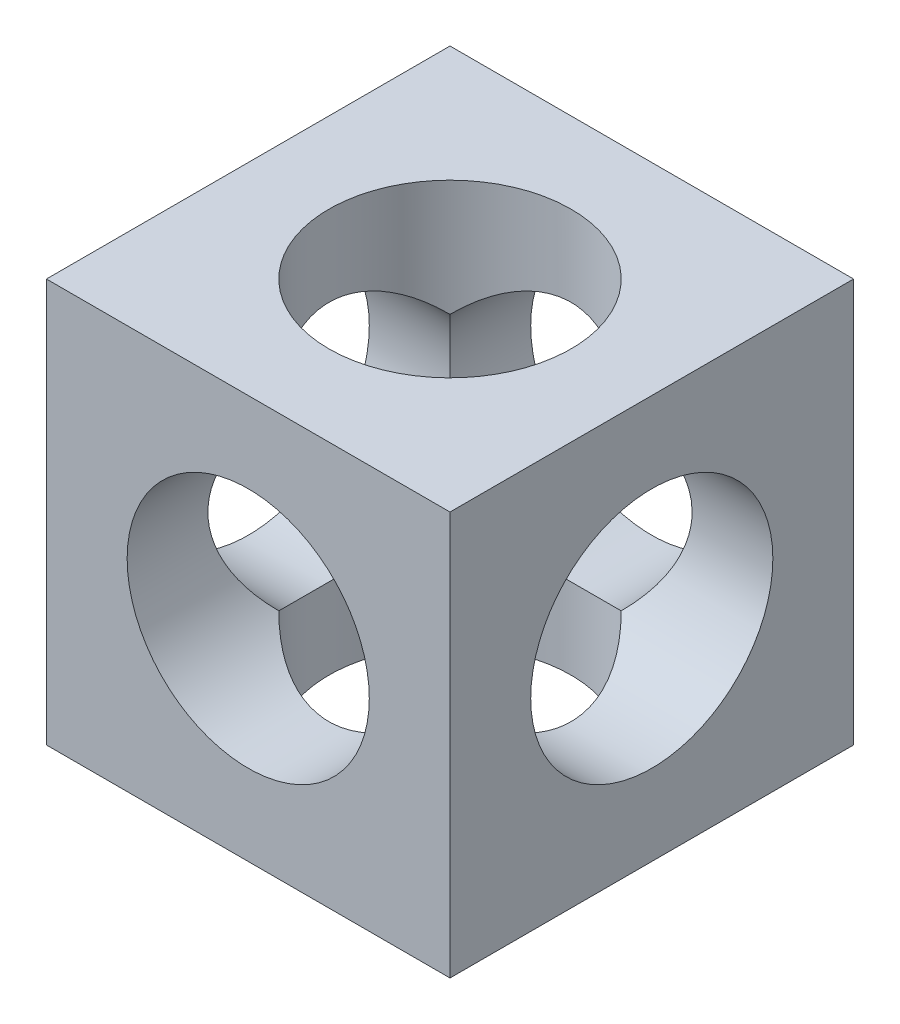
ISO-10303-21;
HEADER;
FILE_DESCRIPTION(('STEP AP214'),'2;1');
FILE_NAME('part.step','',(''),(''),'','','');
FILE_SCHEMA(('AUTOMOTIVE_DESIGN { 1 0 10303 214 1 1 1 1 }'));
ENDSEC;
DATA;
#1=APPLICATION_CONTEXT('core data for automotive mechanical design processes');
#2=APPLICATION_PROTOCOL_DEFINITION('international standard','automotive_design',2000,#1);
#3=PRODUCT_CONTEXT('',#1,'mechanical');
#4=PRODUCT('Part','Part','',(#3));
#5=PRODUCT_RELATED_PRODUCT_CATEGORY('part','',(#4));
#6=PRODUCT_DEFINITION_FORMATION('','',#4);
#7=PRODUCT_DEFINITION_CONTEXT('part definition',#1,'design');
#8=PRODUCT_DEFINITION('design','',#6,#7);
#9=PRODUCT_DEFINITION_SHAPE('','',#8);
#10=(LENGTH_UNIT() NAMED_UNIT(*) SI_UNIT(.MILLI.,.METRE.));
#11=(NAMED_UNIT(*) PLANE_ANGLE_UNIT() SI_UNIT($,.RADIAN.));
#12=(NAMED_UNIT(*) SI_UNIT($,.STERADIAN.) SOLID_ANGLE_UNIT());
#13=UNCERTAINTY_MEASURE_WITH_UNIT(LENGTH_MEASURE(1.E-05),#10,'distance_accuracy_value','');
#14=(GEOMETRIC_REPRESENTATION_CONTEXT(3) GLOBAL_UNCERTAINTY_ASSIGNED_CONTEXT((#13)) GLOBAL_UNIT_ASSIGNED_CONTEXT((#10,
#11,#12)) REPRESENTATION_CONTEXT('',''));
#15=CARTESIAN_POINT('',(0.,0.,0.));
#16=DIRECTION('',(0.,0.,1.));
#17=DIRECTION('',(1.,0.,0.));
#18=AXIS2_PLACEMENT_3D('',#15,#16,#17);
#19=CARTESIAN_POINT('',(2.5,5.,-2.5));
#20=DIRECTION('',(0.,-1.,0.));
#21=DIRECTION('',(0.,0.,-1.));
#22=AXIS2_PLACEMENT_3D('',#19,#20,#21);
#23=CYLINDRICAL_SURFACE('',#22,1.5);
#24=CARTESIAN_POINT('',(2.5,2.5,-2.5));
#25=DIRECTION('',(0.707106781186547,-0.707106781186547,0.));
#26=DIRECTION('',(-0.707106781186547,-0.707106781186547,0.));
#27=AXIS2_PLACEMENT_3D('',#24,#25,#26);
#28=ELLIPSE('',#27,2.12132034355964,1.5);
#29=CARTESIAN_POINT('',(3.56066017177982,3.56066017177982,-1.43933982822018));
#30=VERTEX_POINT('',#29);
#31=CARTESIAN_POINT('',(3.56066017177982,3.56066017177982,-3.56066017177982));
#32=VERTEX_POINT('',#31);
#33=EDGE_CURVE('E109',#30,#32,#28,.F.);
#34=ORIENTED_EDGE('',*,*,#33,.F.);
#35=CARTESIAN_POINT('',(2.5,2.5,-2.5));
#36=DIRECTION('',(0.,-0.707106781186547,0.707106781186547));
#37=DIRECTION('',(0.,-0.707106781186547,-0.707106781186547));
#38=AXIS2_PLACEMENT_3D('',#35,#36,#37);
#39=ELLIPSE('',#38,2.12132034355964,1.5);
#40=CARTESIAN_POINT('',(1.43933982822018,3.56066017177982,-1.43933982822018));
#41=VERTEX_POINT('',#40);
#42=EDGE_CURVE('E116',#41,#30,#39,.F.);
#43=ORIENTED_EDGE('',*,*,#42,.F.);
#44=CARTESIAN_POINT('',(2.5,2.5,-2.5));
#45=DIRECTION('',(-0.707106781186547,-0.707106781186547,0.));
#46=DIRECTION('',(0.707106781186547,-0.707106781186547,0.));
#47=AXIS2_PLACEMENT_3D('',#44,#45,#46);
#48=ELLIPSE('',#47,2.12132034355964,1.5);
#49=CARTESIAN_POINT('',(1.43933982822018,3.56066017177982,-3.56066017177982));
#50=VERTEX_POINT('',#49);
#51=EDGE_CURVE('E69',#50,#41,#48,.F.);
#52=ORIENTED_EDGE('',*,*,#51,.F.);
#53=CARTESIAN_POINT('',(2.5,2.5,-2.5));
#54=DIRECTION('',(0.,-0.707106781186547,-0.707106781186547));
#55=DIRECTION('',(0.,-0.707106781186547,0.707106781186547));
#56=AXIS2_PLACEMENT_3D('',#53,#54,#55);
#57=ELLIPSE('',#56,2.12132034355964,1.5);
#58=EDGE_CURVE('E122',#32,#50,#57,.F.);
#59=ORIENTED_EDGE('',*,*,#58,.F.);
#60=EDGE_LOOP('',(#34,#43,#52,#59));
#61=FACE_BOUND('',#60,.T.);
#62=CARTESIAN_POINT('',(2.5,5.,-2.5));
#63=DIRECTION('',(0.,1.,0.));
#64=DIRECTION('',(0.,0.,1.));
#65=AXIS2_PLACEMENT_3D('',#62,#63,#64);
#66=CIRCLE('',#65,1.5);
#67=CARTESIAN_POINT('',(2.5,5.,-1.));
#68=VERTEX_POINT('',#67);
#69=EDGE_CURVE('E171',#68,#68,#66,.T.);
#70=ORIENTED_EDGE('',*,*,#69,.T.);
#71=EDGE_LOOP('',(#70));
#72=FACE_BOUND('',#71,.T.);
#73=ADVANCED_FACE('F45',(#61,#72),#23,.F.);
#74=CARTESIAN_POINT('',(0.,5.,0.));
#75=DIRECTION('',(0.,-1.,0.));
#76=DIRECTION('',(0.,0.,-1.));
#77=AXIS2_PLACEMENT_3D('',#74,#75,#76);
#78=PLANE('',#77);
#79=DIRECTION('',(0.,0.,1.));
#80=VECTOR('',#79,1.);
#81=CARTESIAN_POINT('',(0.,5.,0.));
#82=LINE('',#81,#80);
#83=CARTESIAN_POINT('',(0.,5.,-5.));
#84=VERTEX_POINT('',#83);
#85=CARTESIAN_POINT('',(0.,5.,0.));
#86=VERTEX_POINT('',#85);
#87=EDGE_CURVE('E160',#84,#86,#82,.T.);
#88=ORIENTED_EDGE('',*,*,#87,.T.);
#89=DIRECTION('',(1.,0.,0.));
#90=VECTOR('',#89,1.);
#91=CARTESIAN_POINT('',(0.,5.,0.));
#92=LINE('',#91,#90);
#93=CARTESIAN_POINT('',(5.,5.,0.));
#94=VERTEX_POINT('',#93);
#95=EDGE_CURVE('E177',#86,#94,#92,.T.);
#96=ORIENTED_EDGE('',*,*,#95,.T.);
#97=DIRECTION('',(0.,0.,-1.));
#98=VECTOR('',#97,1.);
#99=CARTESIAN_POINT('',(5.,5.,0.));
#100=LINE('',#99,#98);
#101=CARTESIAN_POINT('',(5.,5.,-5.));
#102=VERTEX_POINT('',#101);
#103=EDGE_CURVE('E174',#94,#102,#100,.T.);
#104=ORIENTED_EDGE('',*,*,#103,.T.);
#105=DIRECTION('',(-1.,0.,0.));
#106=VECTOR('',#105,1.);
#107=CARTESIAN_POINT('',(0.,5.,-5.));
#108=LINE('',#107,#106);
#109=EDGE_CURVE('E156',#102,#84,#108,.T.);
#110=ORIENTED_EDGE('',*,*,#109,.T.);
#111=EDGE_LOOP('',(#88,#96,#104,#110));
#112=FACE_BOUND('',#111,.T.);
#113=ORIENTED_EDGE('',*,*,#69,.F.);
#114=EDGE_LOOP('',(#113));
#115=FACE_BOUND('',#114,.T.);
#116=ADVANCED_FACE('F231',(#112,#115),#78,.F.);
#117=CARTESIAN_POINT('',(0.,0.,0.));
#118=DIRECTION('',(0.,-1.,0.));
#119=DIRECTION('',(0.,0.,-1.));
#120=AXIS2_PLACEMENT_3D('',#117,#118,#119);
#121=PLANE('',#120);
#122=DIRECTION('',(0.,0.,1.));
#123=VECTOR('',#122,1.);
#124=CARTESIAN_POINT('',(0.,0.,0.));
#125=LINE('',#124,#123);
#126=CARTESIAN_POINT('',(0.,0.,-5.));
#127=VERTEX_POINT('',#126);
#128=CARTESIAN_POINT('',(0.,0.,0.));
#129=VERTEX_POINT('',#128);
#130=EDGE_CURVE('E167',#127,#129,#125,.T.);
#131=ORIENTED_EDGE('',*,*,#130,.F.);
#132=DIRECTION('',(-1.,0.,0.));
#133=VECTOR('',#132,1.);
#134=CARTESIAN_POINT('',(0.,0.,-5.));
#135=LINE('',#134,#133);
#136=CARTESIAN_POINT('',(5.,0.,-5.));
#137=VERTEX_POINT('',#136);
#138=EDGE_CURVE('E157',#137,#127,#135,.T.);
#139=ORIENTED_EDGE('',*,*,#138,.F.);
#140=DIRECTION('',(0.,0.,-1.));
#141=VECTOR('',#140,1.);
#142=CARTESIAN_POINT('',(5.,0.,0.));
#143=LINE('',#142,#141);
#144=CARTESIAN_POINT('',(5.,0.,0.));
#145=VERTEX_POINT('',#144);
#146=EDGE_CURVE('E161',#145,#137,#143,.T.);
#147=ORIENTED_EDGE('',*,*,#146,.F.);
#148=DIRECTION('',(1.,0.,0.));
#149=VECTOR('',#148,1.);
#150=CARTESIAN_POINT('',(0.,0.,0.));
#151=LINE('',#150,#149);
#152=EDGE_CURVE('E164',#129,#145,#151,.T.);
#153=ORIENTED_EDGE('',*,*,#152,.F.);
#154=EDGE_LOOP('',(#131,#139,#147,#153));
#155=FACE_BOUND('',#154,.T.);
#156=CARTESIAN_POINT('',(2.5,0.,-2.5));
#157=DIRECTION('',(0.,1.,0.));
#158=DIRECTION('',(0.,0.,1.));
#159=AXIS2_PLACEMENT_3D('',#156,#157,#158);
#160=CIRCLE('',#159,1.5);
#161=CARTESIAN_POINT('',(2.5,0.,-1.));
#162=VERTEX_POINT('',#161);
#163=EDGE_CURVE('E183',#162,#162,#160,.T.);
#164=ORIENTED_EDGE('',*,*,#163,.T.);
#165=EDGE_LOOP('',(#164));
#166=FACE_BOUND('',#165,.T.);
#167=ADVANCED_FACE('F239',(#155,#166),#121,.T.);
#168=CARTESIAN_POINT('',(0.,5.,0.));
#169=DIRECTION('',(1.,0.,0.));
#170=DIRECTION('',(0.,0.,-1.));
#171=AXIS2_PLACEMENT_3D('',#168,#169,#170);
#172=PLANE('',#171);
#173=CARTESIAN_POINT('',(0.,2.5,-2.5));
#174=DIRECTION('',(1.,0.,0.));
#175=DIRECTION('',(0.,0.,-1.));
#176=AXIS2_PLACEMENT_3D('',#173,#174,#175);
#177=CIRCLE('',#176,1.5);
#178=CARTESIAN_POINT('',(0.,2.5,-4.));
#179=VERTEX_POINT('',#178);
#180=EDGE_CURVE('E211',#179,#179,#177,.T.);
#181=ORIENTED_EDGE('',*,*,#180,.T.);
#182=EDGE_LOOP('',(#181));
#183=FACE_BOUND('',#182,.T.);
#184=ORIENTED_EDGE('',*,*,#130,.T.);
#185=DIRECTION('',(0.,-1.,0.));
#186=VECTOR('',#185,1.);
#187=CARTESIAN_POINT('',(0.,5.,0.));
#188=LINE('',#187,#186);
#189=EDGE_CURVE('E140',#86,#129,#188,.T.);
#190=ORIENTED_EDGE('',*,*,#189,.F.);
#191=ORIENTED_EDGE('',*,*,#87,.F.);
#192=DIRECTION('',(0.,-1.,0.));
#193=VECTOR('',#192,1.);
#194=CARTESIAN_POINT('',(0.,5.,-5.));
#195=LINE('',#194,#193);
#196=EDGE_CURVE('E152',#84,#127,#195,.T.);
#197=ORIENTED_EDGE('',*,*,#196,.T.);
#198=EDGE_LOOP('',(#184,#190,#191,#197));
#199=FACE_BOUND('',#198,.T.);
#200=ADVANCED_FACE('F47',(#183,#199),#172,.F.);
#201=CARTESIAN_POINT('',(0.,5.,0.));
#202=DIRECTION('',(0.,0.,-1.));
#203=DIRECTION('',(-1.,0.,0.));
#204=AXIS2_PLACEMENT_3D('',#201,#202,#203);
#205=PLANE('',#204);
#206=CARTESIAN_POINT('',(2.5,2.5,0.));
#207=DIRECTION('',(0.,0.,1.));
#208=DIRECTION('',(1.,0.,0.));
#209=AXIS2_PLACEMENT_3D('',#206,#207,#208);
#210=CIRCLE('',#209,1.5);
#211=CARTESIAN_POINT('',(4.,2.5,0.));
#212=VERTEX_POINT('',#211);
#213=EDGE_CURVE('E191',#212,#212,#210,.T.);
#214=ORIENTED_EDGE('',*,*,#213,.F.);
#215=EDGE_LOOP('',(#214));
#216=FACE_BOUND('',#215,.T.);
#217=ORIENTED_EDGE('',*,*,#152,.T.);
#218=DIRECTION('',(0.,-1.,0.));
#219=VECTOR('',#218,1.);
#220=CARTESIAN_POINT('',(5.,5.,0.));
#221=LINE('',#220,#219);
#222=EDGE_CURVE('E144',#94,#145,#221,.T.);
#223=ORIENTED_EDGE('',*,*,#222,.F.);
#224=ORIENTED_EDGE('',*,*,#95,.F.);
#225=ORIENTED_EDGE('',*,*,#189,.T.);
#226=EDGE_LOOP('',(#217,#223,#224,#225));
#227=FACE_BOUND('',#226,.T.);
#228=ADVANCED_FACE('F265',(#216,#227),#205,.F.);
#229=CARTESIAN_POINT('',(5.,5.,0.));
#230=DIRECTION('',(-1.,0.,0.));
#231=DIRECTION('',(0.,0.,1.));
#232=AXIS2_PLACEMENT_3D('',#229,#230,#231);
#233=PLANE('',#232);
#234=CARTESIAN_POINT('',(5.,2.5,-2.5));
#235=DIRECTION('',(1.,0.,0.));
#236=DIRECTION('',(0.,0.,-1.));
#237=AXIS2_PLACEMENT_3D('',#234,#235,#236);
#238=CIRCLE('',#237,1.5);
#239=CARTESIAN_POINT('',(5.,2.5,-4.));
#240=VERTEX_POINT('',#239);
#241=EDGE_CURVE('E212',#240,#240,#238,.T.);
#242=ORIENTED_EDGE('',*,*,#241,.F.);
#243=EDGE_LOOP('',(#242));
#244=FACE_BOUND('',#243,.T.);
#245=ORIENTED_EDGE('',*,*,#146,.T.);
#246=DIRECTION('',(0.,-1.,0.));
#247=VECTOR('',#246,1.);
#248=CARTESIAN_POINT('',(5.,5.,-5.));
#249=LINE('',#248,#247);
#250=EDGE_CURVE('E148',#102,#137,#249,.T.);
#251=ORIENTED_EDGE('',*,*,#250,.F.);
#252=ORIENTED_EDGE('',*,*,#103,.F.);
#253=ORIENTED_EDGE('',*,*,#222,.T.);
#254=EDGE_LOOP('',(#245,#251,#252,#253));
#255=FACE_BOUND('',#254,.T.);
#256=ADVANCED_FACE('F251',(#244,#255),#233,.F.);
#257=CARTESIAN_POINT('',(0.,5.,-5.));
#258=DIRECTION('',(0.,0.,1.));
#259=DIRECTION('',(1.,0.,0.));
#260=AXIS2_PLACEMENT_3D('',#257,#258,#259);
#261=PLANE('',#260);
#262=CARTESIAN_POINT('',(2.5,2.5,-5.));
#263=DIRECTION('',(0.,0.,1.));
#264=DIRECTION('',(1.,0.,0.));
#265=AXIS2_PLACEMENT_3D('',#262,#263,#264);
#266=CIRCLE('',#265,1.5);
#267=CARTESIAN_POINT('',(4.,2.5,-5.));
#268=VERTEX_POINT('',#267);
#269=EDGE_CURVE('E187',#268,#268,#266,.T.);
#270=ORIENTED_EDGE('',*,*,#269,.T.);
#271=EDGE_LOOP('',(#270));
#272=FACE_BOUND('',#271,.T.);
#273=ORIENTED_EDGE('',*,*,#138,.T.);
#274=ORIENTED_EDGE('',*,*,#196,.F.);
#275=ORIENTED_EDGE('',*,*,#109,.F.);
#276=ORIENTED_EDGE('',*,*,#250,.T.);
#277=EDGE_LOOP('',(#273,#274,#275,#276));
#278=FACE_BOUND('',#277,.T.);
#279=ADVANCED_FACE('F244',(#272,#278),#261,.F.);
#280=CARTESIAN_POINT('',(2.5,2.5,-2.5));
#281=DIRECTION('',(0.707106781186547,-0.707106781186547,0.));
#282=DIRECTION('',(-0.707106781186547,-0.707106781186547,0.));
#283=AXIS2_PLACEMENT_3D('',#280,#281,#282);
#284=ELLIPSE('',#283,2.12132034355964,1.5);
#285=CARTESIAN_POINT('',(1.43933982822018,1.43933982822018,-1.43933982822018));
#286=VERTEX_POINT('',#285);
#287=CARTESIAN_POINT('',(1.43933982822018,1.43933982822018,-3.56066017177982));
#288=VERTEX_POINT('',#287);
#289=EDGE_CURVE('E204',#286,#288,#284,.T.);
#290=ORIENTED_EDGE('',*,*,#289,.F.);
#291=CARTESIAN_POINT('',(2.5,2.5,-2.5));
#292=DIRECTION('',(0.,-0.707106781186547,-0.707106781186547));
#293=DIRECTION('',(0.,-0.707106781186547,0.707106781186547));
#294=AXIS2_PLACEMENT_3D('',#291,#292,#293);
#295=ELLIPSE('',#294,2.12132034355964,1.5);
#296=CARTESIAN_POINT('',(3.56066017177982,1.43933982822018,-1.43933982822018));
#297=VERTEX_POINT('',#296);
#298=EDGE_CURVE('E133',#297,#286,#295,.T.);
#299=ORIENTED_EDGE('',*,*,#298,.F.);
#300=CARTESIAN_POINT('',(2.5,2.5,-2.5));
#301=DIRECTION('',(-0.707106781186547,-0.707106781186547,0.));
#302=DIRECTION('',(0.707106781186547,-0.707106781186547,0.));
#303=AXIS2_PLACEMENT_3D('',#300,#301,#302);
#304=ELLIPSE('',#303,2.12132034355964,1.5);
#305=CARTESIAN_POINT('',(3.56066017177982,1.43933982822018,-3.56066017177982));
#306=VERTEX_POINT('',#305);
#307=EDGE_CURVE('E61',#306,#297,#304,.T.);
#308=ORIENTED_EDGE('',*,*,#307,.F.);
#309=CARTESIAN_POINT('',(2.5,2.5,-2.5));
#310=DIRECTION('',(0.,-0.707106781186547,0.707106781186547));
#311=DIRECTION('',(0.,-0.707106781186547,-0.707106781186547));
#312=AXIS2_PLACEMENT_3D('',#309,#310,#311);
#313=ELLIPSE('',#312,2.12132034355964,1.5);
#314=EDGE_CURVE('E129',#288,#306,#313,.T.);
#315=ORIENTED_EDGE('',*,*,#314,.F.);
#316=EDGE_LOOP('',(#290,#299,#308,#315));
#317=FACE_BOUND('',#316,.T.);
#318=ORIENTED_EDGE('',*,*,#163,.F.);
#319=EDGE_LOOP('',(#318));
#320=FACE_BOUND('',#319,.T.);
#321=ADVANCED_FACE('F233',(#317,#320),#23,.F.);
#322=CARTESIAN_POINT('',(2.5,2.5,-5.));
#323=DIRECTION('',(0.,0.,1.));
#324=DIRECTION('',(1.,0.,0.));
#325=AXIS2_PLACEMENT_3D('',#322,#323,#324);
#326=CYLINDRICAL_SURFACE('',#325,1.5);
#327=ORIENTED_EDGE('',*,*,#314,.T.);
#328=CARTESIAN_POINT('',(2.5,2.5,-2.5));
#329=DIRECTION('',(0.707106781186547,0.,0.707106781186547));
#330=DIRECTION('',(-0.707106781186547,0.,0.707106781186547));
#331=AXIS2_PLACEMENT_3D('',#328,#329,#330);
#332=ELLIPSE('',#331,2.12132034355964,1.5);
#333=EDGE_CURVE('E124',#306,#32,#332,.T.);
#334=ORIENTED_EDGE('',*,*,#333,.T.);
#335=ORIENTED_EDGE('',*,*,#58,.T.);
#336=CARTESIAN_POINT('',(2.5,2.5,-2.5));
#337=DIRECTION('',(-0.707106781186547,0.,0.707106781186547));
#338=DIRECTION('',(0.707106781186547,0.,0.707106781186547));
#339=AXIS2_PLACEMENT_3D('',#336,#337,#338);
#340=ELLIPSE('',#339,2.12132034355964,1.5);
#341=EDGE_CURVE('E195',#50,#288,#340,.T.);
#342=ORIENTED_EDGE('',*,*,#341,.T.);
#343=EDGE_LOOP('',(#327,#334,#335,#342));
#344=FACE_BOUND('',#343,.T.);
#345=ORIENTED_EDGE('',*,*,#269,.F.);
#346=EDGE_LOOP('',(#345));
#347=FACE_BOUND('',#346,.T.);
#348=ADVANCED_FACE('F243',(#344,#347),#326,.F.);
#349=ORIENTED_EDGE('',*,*,#298,.T.);
#350=CARTESIAN_POINT('',(2.5,2.5,-2.5));
#351=DIRECTION('',(0.707106781186547,0.,0.707106781186547));
#352=DIRECTION('',(-0.707106781186547,0.,0.707106781186547));
#353=AXIS2_PLACEMENT_3D('',#350,#351,#352);
#354=ELLIPSE('',#353,2.12132034355964,1.5);
#355=EDGE_CURVE('E11',#286,#41,#354,.F.);
#356=ORIENTED_EDGE('',*,*,#355,.T.);
#357=ORIENTED_EDGE('',*,*,#42,.T.);
#358=CARTESIAN_POINT('',(2.5,2.5,-2.5));
#359=DIRECTION('',(-0.707106781186547,0.,0.707106781186547));
#360=DIRECTION('',(0.707106781186547,0.,0.707106781186547));
#361=AXIS2_PLACEMENT_3D('',#358,#359,#360);
#362=ELLIPSE('',#361,2.12132034355964,1.5);
#363=EDGE_CURVE('E54',#30,#297,#362,.F.);
#364=ORIENTED_EDGE('',*,*,#363,.T.);
#365=EDGE_LOOP('',(#349,#356,#357,#364));
#366=FACE_BOUND('',#365,.T.);
#367=ORIENTED_EDGE('',*,*,#213,.T.);
#368=EDGE_LOOP('',(#367));
#369=FACE_BOUND('',#368,.T.);
#370=ADVANCED_FACE('F126',(#366,#369),#326,.F.);
#371=CARTESIAN_POINT('',(0.,2.5,-2.5));
#372=DIRECTION('',(1.,0.,0.));
#373=DIRECTION('',(0.,0.,-1.));
#374=AXIS2_PLACEMENT_3D('',#371,#372,#373);
#375=CYLINDRICAL_SURFACE('',#374,1.5);
#376=ORIENTED_EDGE('',*,*,#241,.T.);
#377=EDGE_LOOP('',(#376));
#378=FACE_BOUND('',#377,.T.);
#379=ORIENTED_EDGE('',*,*,#307,.T.);
#380=ORIENTED_EDGE('',*,*,#363,.F.);
#381=ORIENTED_EDGE('',*,*,#33,.T.);
#382=ORIENTED_EDGE('',*,*,#333,.F.);
#383=EDGE_LOOP('',(#379,#380,#381,#382));
#384=FACE_BOUND('',#383,.T.);
#385=ADVANCED_FACE('F108',(#378,#384),#375,.F.);
#386=ORIENTED_EDGE('',*,*,#180,.F.);
#387=EDGE_LOOP('',(#386));
#388=FACE_BOUND('',#387,.T.);
#389=ORIENTED_EDGE('',*,*,#51,.T.);
#390=ORIENTED_EDGE('',*,*,#355,.F.);
#391=ORIENTED_EDGE('',*,*,#289,.T.);
#392=ORIENTED_EDGE('',*,*,#341,.F.);
#393=EDGE_LOOP('',(#389,#390,#391,#392));
#394=FACE_BOUND('',#393,.T.);
#395=ADVANCED_FACE('F222',(#388,#394),#375,.F.);
#396=CLOSED_SHELL('',(#73,#116,#167,#200,#228,#256,#279,#321,#348,#370,#385,#395));
#397=MANIFOLD_SOLID_BREP('B2',#396);
#398=ADVANCED_BREP_SHAPE_REPRESENTATION('',(#18,#397),#14);
#399=SHAPE_DEFINITION_REPRESENTATION(#9,#398);
ENDSEC;
END-ISO-10303-21;
